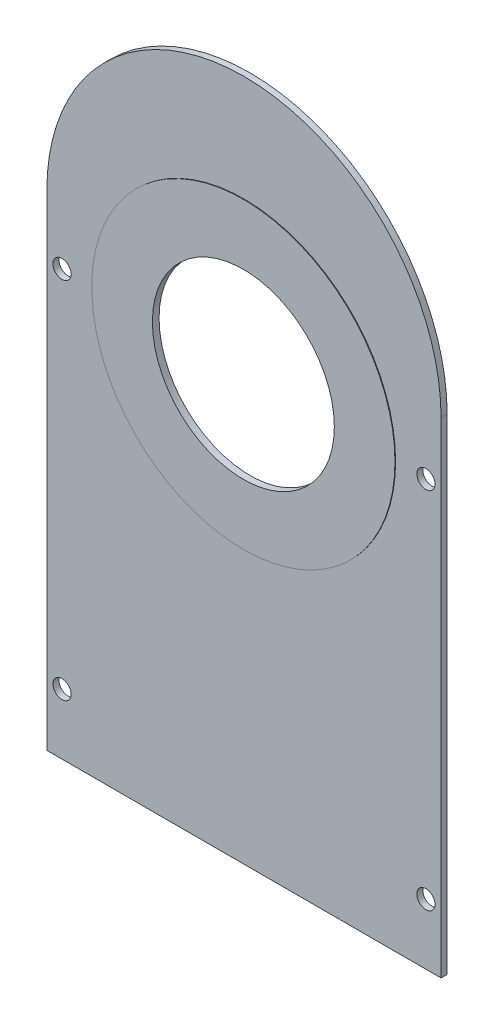
ISO-10303-21;
HEADER;
FILE_DESCRIPTION(('STEP AP214'),'2;1');
FILE_NAME('part.step','',(''),(''),'','','');
FILE_SCHEMA(('AUTOMOTIVE_DESIGN { 1 0 10303 214 1 1 1 1 }'));
ENDSEC;
DATA;
#1=APPLICATION_CONTEXT('core data for automotive mechanical design processes');
#2=APPLICATION_PROTOCOL_DEFINITION('international standard','automotive_design',2000,#1);
#3=PRODUCT_CONTEXT('',#1,'mechanical');
#4=PRODUCT('Part','Part','',(#3));
#5=PRODUCT_RELATED_PRODUCT_CATEGORY('part','',(#4));
#6=PRODUCT_DEFINITION_FORMATION('','',#4);
#7=PRODUCT_DEFINITION_CONTEXT('part definition',#1,'design');
#8=PRODUCT_DEFINITION('design','',#6,#7);
#9=PRODUCT_DEFINITION_SHAPE('','',#8);
#10=(LENGTH_UNIT() NAMED_UNIT(*) SI_UNIT(.MILLI.,.METRE.));
#11=(NAMED_UNIT(*) PLANE_ANGLE_UNIT() SI_UNIT($,.RADIAN.));
#12=(NAMED_UNIT(*) SI_UNIT($,.STERADIAN.) SOLID_ANGLE_UNIT());
#13=UNCERTAINTY_MEASURE_WITH_UNIT(LENGTH_MEASURE(1.E-05),#10,'distance_accuracy_value','');
#14=(GEOMETRIC_REPRESENTATION_CONTEXT(3) GLOBAL_UNCERTAINTY_ASSIGNED_CONTEXT((#13)) GLOBAL_UNIT_ASSIGNED_CONTEXT((#10,
#11,#12)) REPRESENTATION_CONTEXT('',''));
#15=CARTESIAN_POINT('',(0.,0.,0.));
#16=DIRECTION('',(0.,0.,1.));
#17=DIRECTION('',(1.,0.,0.));
#18=AXIS2_PLACEMENT_3D('',#15,#16,#17);
#19=CARTESIAN_POINT('',(0.,40.,1.));
#20=DIRECTION('',(0.,0.,-1.));
#21=DIRECTION('',(-1.,0.,0.));
#22=AXIS2_PLACEMENT_3D('',#19,#20,#21);
#23=CYLINDRICAL_SURFACE('',#22,32.5);
#24=CARTESIAN_POINT('',(0.,40.,0.));
#25=DIRECTION('',(0.,0.,1.));
#26=DIRECTION('',(1.,0.,0.));
#27=AXIS2_PLACEMENT_3D('',#24,#25,#26);
#28=CIRCLE('',#27,32.5);
#29=CARTESIAN_POINT('',(-32.5,40.,0.));
#30=VERTEX_POINT('',#29);
#31=CARTESIAN_POINT('',(32.5,40.,0.));
#32=VERTEX_POINT('',#31);
#33=EDGE_CURVE('E140',#30,#32,#28,.F.);
#34=ORIENTED_EDGE('',*,*,#33,.F.);
#35=DIRECTION('',(0.,0.,-1.));
#36=VECTOR('',#35,1.);
#37=CARTESIAN_POINT('',(-32.5,40.,1.));
#38=LINE('',#37,#36);
#39=CARTESIAN_POINT('',(-32.5,40.,1.));
#40=VERTEX_POINT('',#39);
#41=EDGE_CURVE('E11',#40,#30,#38,.T.);
#42=ORIENTED_EDGE('',*,*,#41,.F.);
#43=CARTESIAN_POINT('',(0.,40.,1.));
#44=DIRECTION('',(0.,0.,1.));
#45=DIRECTION('',(1.,0.,0.));
#46=AXIS2_PLACEMENT_3D('',#43,#44,#45);
#47=CIRCLE('',#46,32.5);
#48=CARTESIAN_POINT('',(32.5,40.,1.));
#49=VERTEX_POINT('',#48);
#50=EDGE_CURVE('E100',#40,#49,#47,.F.);
#51=ORIENTED_EDGE('',*,*,#50,.T.);
#52=DIRECTION('',(0.,0.,-1.));
#53=VECTOR('',#52,1.);
#54=CARTESIAN_POINT('',(32.5,40.,1.));
#55=LINE('',#54,#53);
#56=EDGE_CURVE('E60',#49,#32,#55,.T.);
#57=ORIENTED_EDGE('',*,*,#56,.T.);
#58=EDGE_LOOP('',(#34,#42,#51,#57));
#59=FACE_BOUND('',#58,.T.);
#60=ADVANCED_FACE('F41',(#59),#23,.T.);
#61=CARTESIAN_POINT('',(-32.5,0.,1.));
#62=DIRECTION('',(1.,0.,0.));
#63=DIRECTION('',(0.,1.,0.));
#64=AXIS2_PLACEMENT_3D('',#61,#62,#63);
#65=PLANE('',#64);
#66=DIRECTION('',(0.,-1.,0.));
#67=VECTOR('',#66,1.);
#68=CARTESIAN_POINT('',(-32.5,0.,0.));
#69=LINE('',#68,#67);
#70=CARTESIAN_POINT('',(-32.5,-40.,0.));
#71=VERTEX_POINT('',#70);
#72=EDGE_CURVE('E106',#30,#71,#69,.T.);
#73=ORIENTED_EDGE('',*,*,#72,.T.);
#74=DIRECTION('',(0.,0.,-1.));
#75=VECTOR('',#74,1.);
#76=CARTESIAN_POINT('',(-32.5,-40.,1.));
#77=LINE('',#76,#75);
#78=CARTESIAN_POINT('',(-32.5,-40.,1.));
#79=VERTEX_POINT('',#78);
#80=EDGE_CURVE('E52',#79,#71,#77,.T.);
#81=ORIENTED_EDGE('',*,*,#80,.F.);
#82=DIRECTION('',(0.,-1.,0.));
#83=VECTOR('',#82,1.);
#84=CARTESIAN_POINT('',(-32.5,0.,1.));
#85=LINE('',#84,#83);
#86=EDGE_CURVE('E95',#40,#79,#85,.T.);
#87=ORIENTED_EDGE('',*,*,#86,.F.);
#88=ORIENTED_EDGE('',*,*,#41,.T.);
#89=EDGE_LOOP('',(#73,#81,#87,#88));
#90=FACE_BOUND('',#89,.T.);
#91=ADVANCED_FACE('F104',(#90),#65,.F.);
#92=CARTESIAN_POINT('',(0.,-40.,1.));
#93=DIRECTION('',(0.,1.,0.));
#94=DIRECTION('',(0.,0.,1.));
#95=AXIS2_PLACEMENT_3D('',#92,#93,#94);
#96=PLANE('',#95);
#97=DIRECTION('',(1.,0.,0.));
#98=VECTOR('',#97,1.);
#99=CARTESIAN_POINT('',(0.,-40.,0.));
#100=LINE('',#99,#98);
#101=CARTESIAN_POINT('',(32.5,-40.,0.));
#102=VERTEX_POINT('',#101);
#103=EDGE_CURVE('E135',#71,#102,#100,.T.);
#104=ORIENTED_EDGE('',*,*,#103,.T.);
#105=DIRECTION('',(0.,0.,-1.));
#106=VECTOR('',#105,1.);
#107=CARTESIAN_POINT('',(32.5,-40.,1.));
#108=LINE('',#107,#106);
#109=CARTESIAN_POINT('',(32.5,-40.,1.));
#110=VERTEX_POINT('',#109);
#111=EDGE_CURVE('E74',#110,#102,#108,.T.);
#112=ORIENTED_EDGE('',*,*,#111,.F.);
#113=DIRECTION('',(1.,0.,0.));
#114=VECTOR('',#113,1.);
#115=CARTESIAN_POINT('',(0.,-40.,1.));
#116=LINE('',#115,#114);
#117=EDGE_CURVE('E86',#79,#110,#116,.T.);
#118=ORIENTED_EDGE('',*,*,#117,.F.);
#119=ORIENTED_EDGE('',*,*,#80,.T.);
#120=EDGE_LOOP('',(#104,#112,#118,#119));
#121=FACE_BOUND('',#120,.T.);
#122=ADVANCED_FACE('F88',(#121),#96,.F.);
#123=CARTESIAN_POINT('',(-30.,-30.,1.));
#124=DIRECTION('',(0.,0.,-1.));
#125=DIRECTION('',(-1.,0.,0.));
#126=AXIS2_PLACEMENT_3D('',#123,#124,#125);
#127=CYLINDRICAL_SURFACE('',#126,1.5);
#128=CARTESIAN_POINT('',(-30.,-30.,1.));
#129=DIRECTION('',(0.,0.,1.));
#130=DIRECTION('',(1.,0.,0.));
#131=AXIS2_PLACEMENT_3D('',#128,#129,#130);
#132=CIRCLE('',#131,1.5);
#133=CARTESIAN_POINT('',(-28.5,-30.,1.));
#134=VERTEX_POINT('',#133);
#135=EDGE_CURVE('E151',#134,#134,#132,.T.);
#136=ORIENTED_EDGE('',*,*,#135,.T.);
#137=EDGE_LOOP('',(#136));
#138=FACE_BOUND('',#137,.T.);
#139=CARTESIAN_POINT('',(-30.,-30.,0.));
#140=DIRECTION('',(0.,0.,1.));
#141=DIRECTION('',(1.,0.,0.));
#142=AXIS2_PLACEMENT_3D('',#139,#140,#141);
#143=CIRCLE('',#142,1.5);
#144=CARTESIAN_POINT('',(-28.5,-30.,0.));
#145=VERTEX_POINT('',#144);
#146=EDGE_CURVE('E119',#145,#145,#143,.T.);
#147=ORIENTED_EDGE('',*,*,#146,.F.);
#148=EDGE_LOOP('',(#147));
#149=FACE_BOUND('',#148,.T.);
#150=ADVANCED_FACE('F203',(#138,#149),#127,.F.);
#151=CARTESIAN_POINT('',(-30.,30.,1.));
#152=DIRECTION('',(0.,0.,-1.));
#153=DIRECTION('',(-1.,0.,0.));
#154=AXIS2_PLACEMENT_3D('',#151,#152,#153);
#155=CYLINDRICAL_SURFACE('',#154,1.5);
#156=CARTESIAN_POINT('',(-30.,30.,1.));
#157=DIRECTION('',(0.,0.,1.));
#158=DIRECTION('',(1.,0.,0.));
#159=AXIS2_PLACEMENT_3D('',#156,#157,#158);
#160=CIRCLE('',#159,1.5);
#161=CARTESIAN_POINT('',(-28.5,30.,1.));
#162=VERTEX_POINT('',#161);
#163=EDGE_CURVE('E155',#162,#162,#160,.F.);
#164=ORIENTED_EDGE('',*,*,#163,.F.);
#165=EDGE_LOOP('',(#164));
#166=FACE_BOUND('',#165,.T.);
#167=CARTESIAN_POINT('',(-30.,30.,0.));
#168=DIRECTION('',(0.,0.,1.));
#169=DIRECTION('',(1.,0.,0.));
#170=AXIS2_PLACEMENT_3D('',#167,#168,#169);
#171=CIRCLE('',#170,1.5);
#172=CARTESIAN_POINT('',(-28.5,30.,0.));
#173=VERTEX_POINT('',#172);
#174=EDGE_CURVE('E123',#173,#173,#171,.F.);
#175=ORIENTED_EDGE('',*,*,#174,.T.);
#176=EDGE_LOOP('',(#175));
#177=FACE_BOUND('',#176,.T.);
#178=ADVANCED_FACE('F210',(#166,#177),#155,.F.);
#179=CARTESIAN_POINT('',(30.,30.,1.));
#180=DIRECTION('',(0.,0.,-1.));
#181=DIRECTION('',(-1.,0.,0.));
#182=AXIS2_PLACEMENT_3D('',#179,#180,#181);
#183=CYLINDRICAL_SURFACE('',#182,1.5);
#184=CARTESIAN_POINT('',(30.,30.,1.));
#185=DIRECTION('',(0.,0.,1.));
#186=DIRECTION('',(1.,0.,0.));
#187=AXIS2_PLACEMENT_3D('',#184,#185,#186);
#188=CIRCLE('',#187,1.5);
#189=CARTESIAN_POINT('',(31.5,30.,1.));
#190=VERTEX_POINT('',#189);
#191=EDGE_CURVE('E159',#190,#190,#188,.T.);
#192=ORIENTED_EDGE('',*,*,#191,.T.);
#193=EDGE_LOOP('',(#192));
#194=FACE_BOUND('',#193,.T.);
#195=CARTESIAN_POINT('',(30.,30.,0.));
#196=DIRECTION('',(0.,0.,1.));
#197=DIRECTION('',(1.,0.,0.));
#198=AXIS2_PLACEMENT_3D('',#195,#196,#197);
#199=CIRCLE('',#198,1.5);
#200=CARTESIAN_POINT('',(31.5,30.,0.));
#201=VERTEX_POINT('',#200);
#202=EDGE_CURVE('E127',#201,#201,#199,.T.);
#203=ORIENTED_EDGE('',*,*,#202,.F.);
#204=EDGE_LOOP('',(#203));
#205=FACE_BOUND('',#204,.T.);
#206=ADVANCED_FACE('F207',(#194,#205),#183,.F.);
#207=CARTESIAN_POINT('',(32.5,0.,1.));
#208=DIRECTION('',(1.,0.,0.));
#209=DIRECTION('',(0.,1.,0.));
#210=AXIS2_PLACEMENT_3D('',#207,#208,#209);
#211=PLANE('',#210);
#212=DIRECTION('',(0.,-1.,0.));
#213=VECTOR('',#212,1.);
#214=CARTESIAN_POINT('',(32.5,0.,0.));
#215=LINE('',#214,#213);
#216=EDGE_CURVE('E131',#32,#102,#215,.T.);
#217=ORIENTED_EDGE('',*,*,#216,.F.);
#218=ORIENTED_EDGE('',*,*,#56,.F.);
#219=DIRECTION('',(0.,-1.,0.));
#220=VECTOR('',#219,1.);
#221=CARTESIAN_POINT('',(32.5,0.,1.));
#222=LINE('',#221,#220);
#223=EDGE_CURVE('E94',#49,#110,#222,.T.);
#224=ORIENTED_EDGE('',*,*,#223,.T.);
#225=ORIENTED_EDGE('',*,*,#111,.T.);
#226=EDGE_LOOP('',(#217,#218,#224,#225));
#227=FACE_BOUND('',#226,.T.);
#228=ADVANCED_FACE('F204',(#227),#211,.T.);
#229=CARTESIAN_POINT('',(0.,30.,1.));
#230=DIRECTION('',(0.,0.,-1.));
#231=DIRECTION('',(-1.,0.,0.));
#232=AXIS2_PLACEMENT_3D('',#229,#230,#231);
#233=CYLINDRICAL_SURFACE('',#232,15.);
#234=CARTESIAN_POINT('',(0.,30.,0.));
#235=DIRECTION('',(0.,0.,1.));
#236=DIRECTION('',(1.,0.,0.));
#237=AXIS2_PLACEMENT_3D('',#234,#235,#236);
#238=CIRCLE('',#237,15.);
#239=CARTESIAN_POINT('',(15.,30.,0.));
#240=VERTEX_POINT('',#239);
#241=EDGE_CURVE('E143',#240,#240,#238,.T.);
#242=ORIENTED_EDGE('',*,*,#241,.F.);
#243=EDGE_LOOP('',(#242));
#244=FACE_BOUND('',#243,.T.);
#245=CARTESIAN_POINT('',(0.,30.,1.1));
#246=DIRECTION('',(0.,0.,1.));
#247=DIRECTION('',(1.,0.,0.));
#248=AXIS2_PLACEMENT_3D('',#245,#246,#247);
#249=CIRCLE('',#248,15.);
#250=CARTESIAN_POINT('',(15.,30.,1.1));
#251=VERTEX_POINT('',#250);
#252=EDGE_CURVE('E45',#251,#251,#249,.T.);
#253=ORIENTED_EDGE('',*,*,#252,.T.);
#254=EDGE_LOOP('',(#253));
#255=FACE_BOUND('',#254,.T.);
#256=ADVANCED_FACE('F43',(#244,#255),#233,.F.);
#257=CARTESIAN_POINT('',(30.,-30.,1.));
#258=DIRECTION('',(0.,0.,-1.));
#259=DIRECTION('',(-1.,0.,0.));
#260=AXIS2_PLACEMENT_3D('',#257,#258,#259);
#261=CYLINDRICAL_SURFACE('',#260,1.5);
#262=CARTESIAN_POINT('',(30.,-30.,1.));
#263=DIRECTION('',(0.,0.,1.));
#264=DIRECTION('',(1.,0.,0.));
#265=AXIS2_PLACEMENT_3D('',#262,#263,#264);
#266=CIRCLE('',#265,1.5);
#267=CARTESIAN_POINT('',(31.5,-30.,1.));
#268=VERTEX_POINT('',#267);
#269=EDGE_CURVE('E114',#268,#268,#266,.F.);
#270=ORIENTED_EDGE('',*,*,#269,.F.);
#271=EDGE_LOOP('',(#270));
#272=FACE_BOUND('',#271,.T.);
#273=CARTESIAN_POINT('',(30.,-30.,0.));
#274=DIRECTION('',(0.,0.,1.));
#275=DIRECTION('',(1.,0.,0.));
#276=AXIS2_PLACEMENT_3D('',#273,#274,#275);
#277=CIRCLE('',#276,1.5);
#278=CARTESIAN_POINT('',(31.5,-30.,0.));
#279=VERTEX_POINT('',#278);
#280=EDGE_CURVE('E115',#279,#279,#277,.F.);
#281=ORIENTED_EDGE('',*,*,#280,.T.);
#282=EDGE_LOOP('',(#281));
#283=FACE_BOUND('',#282,.T.);
#284=ADVANCED_FACE('F185',(#272,#283),#261,.F.);
#285=CARTESIAN_POINT('',(0.,0.,1.));
#286=DIRECTION('',(0.,0.,1.));
#287=DIRECTION('',(1.,0.,0.));
#288=AXIS2_PLACEMENT_3D('',#285,#286,#287);
#289=PLANE('',#288);
#290=CARTESIAN_POINT('',(0.,30.,1.));
#291=DIRECTION('',(0.,0.,1.));
#292=DIRECTION('',(1.,0.,0.));
#293=AXIS2_PLACEMENT_3D('',#290,#291,#292);
#294=CIRCLE('',#293,25.);
#295=CARTESIAN_POINT('',(25.,30.,1.));
#296=VERTEX_POINT('',#295);
#297=EDGE_CURVE('E167',#296,#296,#294,.T.);
#298=ORIENTED_EDGE('',*,*,#297,.F.);
#299=EDGE_LOOP('',(#298));
#300=FACE_BOUND('',#299,.T.);
#301=ORIENTED_EDGE('',*,*,#50,.F.);
#302=ORIENTED_EDGE('',*,*,#86,.T.);
#303=ORIENTED_EDGE('',*,*,#117,.T.);
#304=ORIENTED_EDGE('',*,*,#223,.F.);
#305=EDGE_LOOP('',(#301,#302,#303,#304));
#306=FACE_BOUND('',#305,.T.);
#307=ORIENTED_EDGE('',*,*,#191,.F.);
#308=EDGE_LOOP('',(#307));
#309=FACE_BOUND('',#308,.T.);
#310=ORIENTED_EDGE('',*,*,#163,.T.);
#311=EDGE_LOOP('',(#310));
#312=FACE_BOUND('',#311,.T.);
#313=ORIENTED_EDGE('',*,*,#135,.F.);
#314=EDGE_LOOP('',(#313));
#315=FACE_BOUND('',#314,.T.);
#316=ORIENTED_EDGE('',*,*,#269,.T.);
#317=EDGE_LOOP('',(#316));
#318=FACE_BOUND('',#317,.T.);
#319=ADVANCED_FACE('F98',(#300,#306,#309,#312,#315,#318),#289,.T.);
#320=CARTESIAN_POINT('',(0.,0.,0.));
#321=DIRECTION('',(0.,0.,1.));
#322=DIRECTION('',(1.,0.,0.));
#323=AXIS2_PLACEMENT_3D('',#320,#321,#322);
#324=PLANE('',#323);
#325=ORIENTED_EDGE('',*,*,#241,.T.);
#326=EDGE_LOOP('',(#325));
#327=FACE_BOUND('',#326,.T.);
#328=ORIENTED_EDGE('',*,*,#33,.T.);
#329=ORIENTED_EDGE('',*,*,#216,.T.);
#330=ORIENTED_EDGE('',*,*,#103,.F.);
#331=ORIENTED_EDGE('',*,*,#72,.F.);
#332=EDGE_LOOP('',(#328,#329,#330,#331));
#333=FACE_BOUND('',#332,.T.);
#334=ORIENTED_EDGE('',*,*,#202,.T.);
#335=EDGE_LOOP('',(#334));
#336=FACE_BOUND('',#335,.T.);
#337=ORIENTED_EDGE('',*,*,#174,.F.);
#338=EDGE_LOOP('',(#337));
#339=FACE_BOUND('',#338,.T.);
#340=ORIENTED_EDGE('',*,*,#146,.T.);
#341=EDGE_LOOP('',(#340));
#342=FACE_BOUND('',#341,.T.);
#343=ORIENTED_EDGE('',*,*,#280,.F.);
#344=EDGE_LOOP('',(#343));
#345=FACE_BOUND('',#344,.T.);
#346=ADVANCED_FACE('F184',(#327,#333,#336,#339,#342,#345),#324,.F.);
#347=CARTESIAN_POINT('',(0.,30.,1.1));
#348=DIRECTION('',(0.,0.,1.));
#349=DIRECTION('',(1.,0.,0.));
#350=AXIS2_PLACEMENT_3D('',#347,#348,#349);
#351=PLANE('',#350);
#352=ORIENTED_EDGE('',*,*,#252,.F.);
#353=EDGE_LOOP('',(#352));
#354=FACE_BOUND('',#353,.T.);
#355=CARTESIAN_POINT('',(0.,30.,1.1));
#356=DIRECTION('',(0.,0.,1.));
#357=DIRECTION('',(1.,0.,0.));
#358=AXIS2_PLACEMENT_3D('',#355,#356,#357);
#359=CIRCLE('',#358,25.);
#360=CARTESIAN_POINT('',(25.,30.,1.1));
#361=VERTEX_POINT('',#360);
#362=EDGE_CURVE('E147',#361,#361,#359,.T.);
#363=ORIENTED_EDGE('',*,*,#362,.T.);
#364=EDGE_LOOP('',(#363));
#365=FACE_BOUND('',#364,.T.);
#366=ADVANCED_FACE('F175',(#354,#365),#351,.T.);
#367=CARTESIAN_POINT('',(0.,30.,1.1));
#368=DIRECTION('',(0.,0.,-1.));
#369=DIRECTION('',(-1.,0.,0.));
#370=AXIS2_PLACEMENT_3D('',#367,#368,#369);
#371=CYLINDRICAL_SURFACE('',#370,25.);
#372=ORIENTED_EDGE('',*,*,#362,.F.);
#373=EDGE_LOOP('',(#372));
#374=FACE_BOUND('',#373,.T.);
#375=ORIENTED_EDGE('',*,*,#297,.T.);
#376=EDGE_LOOP('',(#375));
#377=FACE_BOUND('',#376,.T.);
#378=ADVANCED_FACE('F177',(#374,#377),#371,.T.);
#379=CLOSED_SHELL('',(#60,#91,#122,#150,#178,#206,#228,#256,#284,#319,#346,#366,#378));
#380=MANIFOLD_SOLID_BREP('B2',#379);
#381=ADVANCED_BREP_SHAPE_REPRESENTATION('',(#18,#380),#14);
#382=SHAPE_DEFINITION_REPRESENTATION(#9,#381);
ENDSEC;
END-ISO-10303-21;
